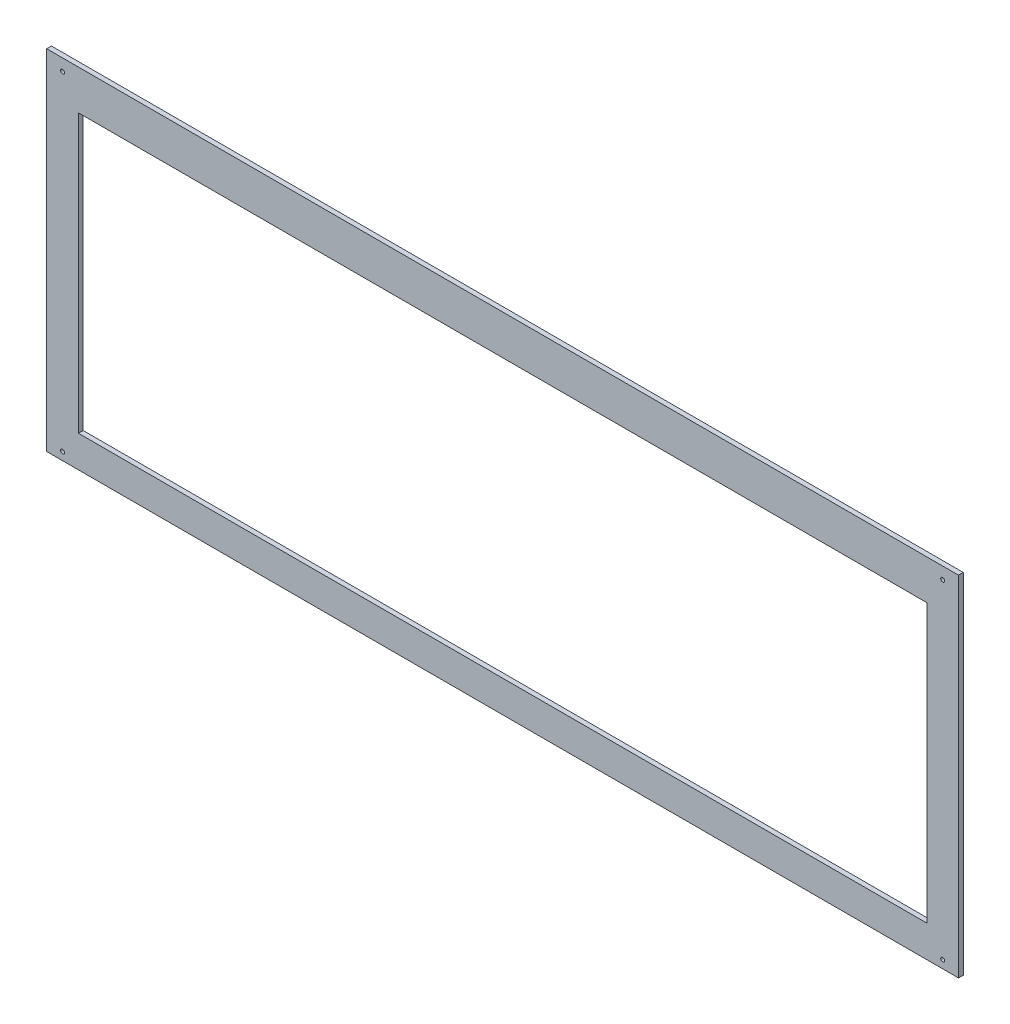
ISO-10303-21;
HEADER;
FILE_DESCRIPTION(('STEP AP214'),'2;1');
FILE_NAME('part.step','',(''),(''),'','','');
FILE_SCHEMA(('AUTOMOTIVE_DESIGN { 1 0 10303 214 1 1 1 1 }'));
ENDSEC;
DATA;
#1=APPLICATION_CONTEXT('core data for automotive mechanical design processes');
#2=APPLICATION_PROTOCOL_DEFINITION('international standard','automotive_design',2000,#1);
#3=PRODUCT_CONTEXT('',#1,'mechanical');
#4=PRODUCT('Part','Part','',(#3));
#5=PRODUCT_RELATED_PRODUCT_CATEGORY('part','',(#4));
#6=PRODUCT_DEFINITION_FORMATION('','',#4);
#7=PRODUCT_DEFINITION_CONTEXT('part definition',#1,'design');
#8=PRODUCT_DEFINITION('design','',#6,#7);
#9=PRODUCT_DEFINITION_SHAPE('','',#8);
#10=(LENGTH_UNIT() NAMED_UNIT(*) SI_UNIT(.MILLI.,.METRE.));
#11=(NAMED_UNIT(*) PLANE_ANGLE_UNIT() SI_UNIT($,.RADIAN.));
#12=(NAMED_UNIT(*) SI_UNIT($,.STERADIAN.) SOLID_ANGLE_UNIT());
#13=UNCERTAINTY_MEASURE_WITH_UNIT(LENGTH_MEASURE(1.E-05),#10,'distance_accuracy_value','');
#14=(GEOMETRIC_REPRESENTATION_CONTEXT(3) GLOBAL_UNCERTAINTY_ASSIGNED_CONTEXT((#13)) GLOBAL_UNIT_ASSIGNED_CONTEXT((#10,
#11,#12)) REPRESENTATION_CONTEXT('',''));
#15=CARTESIAN_POINT('',(0.,0.,0.));
#16=DIRECTION('',(0.,0.,1.));
#17=DIRECTION('',(1.,0.,0.));
#18=AXIS2_PLACEMENT_3D('',#15,#16,#17);
#19=CARTESIAN_POINT('',(0.,0.,6.));
#20=DIRECTION('',(0.,0.,1.));
#21=DIRECTION('',(1.,0.,0.));
#22=AXIS2_PLACEMENT_3D('',#19,#20,#21);
#23=PLANE('',#22);
#24=CARTESIAN_POINT('',(555.,210.,6.));
#25=DIRECTION('',(0.,0.,1.));
#26=DIRECTION('',(1.,0.,0.));
#27=AXIS2_PLACEMENT_3D('',#24,#25,#26);
#28=CIRCLE('',#27,2.49999999999991);
#29=CARTESIAN_POINT('',(557.5,210.,6.));
#30=VERTEX_POINT('',#29);
#31=EDGE_CURVE('E321',#30,#30,#28,.T.);
#32=ORIENTED_EDGE('',*,*,#31,.F.);
#33=EDGE_LOOP('',(#32));
#34=FACE_BOUND('',#33,.T.);
#35=CARTESIAN_POINT('',(555.,-205.,6.));
#36=DIRECTION('',(0.,0.,1.));
#37=DIRECTION('',(1.,0.,0.));
#38=AXIS2_PLACEMENT_3D('',#35,#36,#37);
#39=CIRCLE('',#38,2.49999999999991);
#40=CARTESIAN_POINT('',(557.5,-205.,6.));
#41=VERTEX_POINT('',#40);
#42=EDGE_CURVE('E323',#41,#41,#39,.T.);
#43=ORIENTED_EDGE('',*,*,#42,.F.);
#44=EDGE_LOOP('',(#43));
#45=FACE_BOUND('',#44,.T.);
#46=CARTESIAN_POINT('',(-555.,-205.,6.));
#47=DIRECTION('',(0.,0.,1.));
#48=DIRECTION('',(1.,0.,0.));
#49=AXIS2_PLACEMENT_3D('',#46,#47,#48);
#50=CIRCLE('',#49,2.49999999999991);
#51=CARTESIAN_POINT('',(-552.5,-205.,6.));
#52=VERTEX_POINT('',#51);
#53=EDGE_CURVE('E329',#52,#52,#50,.T.);
#54=ORIENTED_EDGE('',*,*,#53,.F.);
#55=EDGE_LOOP('',(#54));
#56=FACE_BOUND('',#55,.T.);
#57=CARTESIAN_POINT('',(-555.,210.,6.));
#58=DIRECTION('',(0.,0.,1.));
#59=DIRECTION('',(1.,0.,0.));
#60=AXIS2_PLACEMENT_3D('',#57,#58,#59);
#61=CIRCLE('',#60,2.49999999999991);
#62=CARTESIAN_POINT('',(-552.5,210.,6.));
#63=VERTEX_POINT('',#62);
#64=EDGE_CURVE('E335',#63,#63,#61,.T.);
#65=ORIENTED_EDGE('',*,*,#64,.F.);
#66=EDGE_LOOP('',(#65));
#67=FACE_BOUND('',#66,.T.);
#68=DIRECTION('',(1.,0.,0.));
#69=VECTOR('',#68,1.);
#70=CARTESIAN_POINT('',(-575.,-215.,6.));
#71=LINE('',#70,#69);
#72=CARTESIAN_POINT('',(-575.,-215.,6.));
#73=VERTEX_POINT('',#72);
#74=CARTESIAN_POINT('',(575.,-215.,6.));
#75=VERTEX_POINT('',#74);
#76=EDGE_CURVE('E136',#73,#75,#71,.T.);
#77=ORIENTED_EDGE('',*,*,#76,.T.);
#78=DIRECTION('',(0.,1.,0.));
#79=VECTOR('',#78,1.);
#80=CARTESIAN_POINT('',(575.,-215.,6.));
#81=LINE('',#80,#79);
#82=CARTESIAN_POINT('',(575.,225.,6.));
#83=VERTEX_POINT('',#82);
#84=EDGE_CURVE('E139',#75,#83,#81,.T.);
#85=ORIENTED_EDGE('',*,*,#84,.T.);
#86=DIRECTION('',(-1.,0.,0.));
#87=VECTOR('',#86,1.);
#88=CARTESIAN_POINT('',(535.,225.,6.));
#89=LINE('',#88,#87);
#90=CARTESIAN_POINT('',(-575.,225.,6.));
#91=VERTEX_POINT('',#90);
#92=EDGE_CURVE('E142',#83,#91,#89,.T.);
#93=ORIENTED_EDGE('',*,*,#92,.T.);
#94=DIRECTION('',(0.,-1.,0.));
#95=VECTOR('',#94,1.);
#96=CARTESIAN_POINT('',(-575.,175.,6.));
#97=LINE('',#96,#95);
#98=EDGE_CURVE('E144',#91,#73,#97,.T.);
#99=ORIENTED_EDGE('',*,*,#98,.T.);
#100=EDGE_LOOP('',(#77,#85,#93,#99));
#101=FACE_BOUND('',#100,.T.);
#102=DIRECTION('',(-1.,0.,0.));
#103=VECTOR('',#102,1.);
#104=CARTESIAN_POINT('',(-535.,175.,6.));
#105=LINE('',#104,#103);
#106=CARTESIAN_POINT('',(535.,175.,6.));
#107=VERTEX_POINT('',#106);
#108=CARTESIAN_POINT('',(-535.,175.,6.));
#109=VERTEX_POINT('',#108);
#110=EDGE_CURVE('E106',#107,#109,#105,.T.);
#111=ORIENTED_EDGE('',*,*,#110,.F.);
#112=DIRECTION('',(0.,1.,0.));
#113=VECTOR('',#112,1.);
#114=CARTESIAN_POINT('',(535.,-175.,6.));
#115=LINE('',#114,#113);
#116=CARTESIAN_POINT('',(535.,-175.,6.));
#117=VERTEX_POINT('',#116);
#118=EDGE_CURVE('E98',#117,#107,#115,.T.);
#119=ORIENTED_EDGE('',*,*,#118,.F.);
#120=DIRECTION('',(1.,0.,0.));
#121=VECTOR('',#120,1.);
#122=CARTESIAN_POINT('',(-535.,-175.,6.));
#123=LINE('',#122,#121);
#124=CARTESIAN_POINT('',(-535.,-175.,6.));
#125=VERTEX_POINT('',#124);
#126=EDGE_CURVE('E120',#125,#117,#123,.T.);
#127=ORIENTED_EDGE('',*,*,#126,.F.);
#128=DIRECTION('',(0.,-1.,0.));
#129=VECTOR('',#128,1.);
#130=CARTESIAN_POINT('',(-535.,-175.,6.));
#131=LINE('',#130,#129);
#132=EDGE_CURVE('E118',#109,#125,#131,.T.);
#133=ORIENTED_EDGE('',*,*,#132,.F.);
#134=EDGE_LOOP('',(#111,#119,#127,#133));
#135=FACE_BOUND('',#134,.T.);
#136=ADVANCED_FACE('F33',(#34,#45,#56,#67,#101,#135),#23,.T.);
#137=CARTESIAN_POINT('',(0.,0.,0.));
#138=DIRECTION('',(0.,0.,1.));
#139=DIRECTION('',(1.,0.,0.));
#140=AXIS2_PLACEMENT_3D('',#137,#138,#139);
#141=PLANE('',#140);
#142=CARTESIAN_POINT('',(555.,210.,0.));
#143=DIRECTION('',(0.,0.,1.));
#144=DIRECTION('',(1.,0.,0.));
#145=AXIS2_PLACEMENT_3D('',#142,#143,#144);
#146=CIRCLE('',#145,2.49999999999991);
#147=CARTESIAN_POINT('',(557.5,210.,0.));
#148=VERTEX_POINT('',#147);
#149=EDGE_CURVE('E319',#148,#148,#146,.T.);
#150=ORIENTED_EDGE('',*,*,#149,.T.);
#151=EDGE_LOOP('',(#150));
#152=FACE_BOUND('',#151,.T.);
#153=CARTESIAN_POINT('',(555.,-205.,0.));
#154=DIRECTION('',(0.,0.,1.));
#155=DIRECTION('',(1.,0.,0.));
#156=AXIS2_PLACEMENT_3D('',#153,#154,#155);
#157=CIRCLE('',#156,2.49999999999991);
#158=CARTESIAN_POINT('',(557.5,-205.,0.));
#159=VERTEX_POINT('',#158);
#160=EDGE_CURVE('E326',#159,#159,#157,.T.);
#161=ORIENTED_EDGE('',*,*,#160,.T.);
#162=EDGE_LOOP('',(#161));
#163=FACE_BOUND('',#162,.T.);
#164=CARTESIAN_POINT('',(-555.,-205.,0.));
#165=DIRECTION('',(0.,0.,1.));
#166=DIRECTION('',(1.,0.,0.));
#167=AXIS2_PLACEMENT_3D('',#164,#165,#166);
#168=CIRCLE('',#167,2.49999999999991);
#169=CARTESIAN_POINT('',(-552.5,-205.,0.));
#170=VERTEX_POINT('',#169);
#171=EDGE_CURVE('E332',#170,#170,#168,.T.);
#172=ORIENTED_EDGE('',*,*,#171,.T.);
#173=EDGE_LOOP('',(#172));
#174=FACE_BOUND('',#173,.T.);
#175=CARTESIAN_POINT('',(-555.,210.,0.));
#176=DIRECTION('',(0.,0.,1.));
#177=DIRECTION('',(1.,0.,0.));
#178=AXIS2_PLACEMENT_3D('',#175,#176,#177);
#179=CIRCLE('',#178,2.49999999999991);
#180=CARTESIAN_POINT('',(-552.5,210.,0.));
#181=VERTEX_POINT('',#180);
#182=EDGE_CURVE('E126',#181,#181,#179,.T.);
#183=ORIENTED_EDGE('',*,*,#182,.T.);
#184=EDGE_LOOP('',(#183));
#185=FACE_BOUND('',#184,.T.);
#186=DIRECTION('',(1.,0.,0.));
#187=VECTOR('',#186,1.);
#188=CARTESIAN_POINT('',(-575.,-215.,0.));
#189=LINE('',#188,#187);
#190=CARTESIAN_POINT('',(-575.,-215.,0.));
#191=VERTEX_POINT('',#190);
#192=CARTESIAN_POINT('',(575.,-215.,0.));
#193=VERTEX_POINT('',#192);
#194=EDGE_CURVE('E114',#191,#193,#189,.T.);
#195=ORIENTED_EDGE('',*,*,#194,.F.);
#196=DIRECTION('',(0.,-1.,0.));
#197=VECTOR('',#196,1.);
#198=CARTESIAN_POINT('',(-575.,-215.,0.));
#199=LINE('',#198,#197);
#200=CARTESIAN_POINT('',(-575.,225.,0.));
#201=VERTEX_POINT('',#200);
#202=EDGE_CURVE('E140',#201,#191,#199,.T.);
#203=ORIENTED_EDGE('',*,*,#202,.F.);
#204=DIRECTION('',(-1.,0.,0.));
#205=VECTOR('',#204,1.);
#206=CARTESIAN_POINT('',(-575.,225.,0.));
#207=LINE('',#206,#205);
#208=CARTESIAN_POINT('',(575.,225.,0.));
#209=VERTEX_POINT('',#208);
#210=EDGE_CURVE('E152',#209,#201,#207,.T.);
#211=ORIENTED_EDGE('',*,*,#210,.F.);
#212=DIRECTION('',(0.,1.,0.));
#213=VECTOR('',#212,1.);
#214=CARTESIAN_POINT('',(575.,225.,0.));
#215=LINE('',#214,#213);
#216=EDGE_CURVE('E149',#193,#209,#215,.T.);
#217=ORIENTED_EDGE('',*,*,#216,.F.);
#218=EDGE_LOOP('',(#195,#203,#211,#217));
#219=FACE_BOUND('',#218,.T.);
#220=DIRECTION('',(0.,1.,0.));
#221=VECTOR('',#220,1.);
#222=CARTESIAN_POINT('',(535.,-175.,0.));
#223=LINE('',#222,#221);
#224=CARTESIAN_POINT('',(535.,-175.,0.));
#225=VERTEX_POINT('',#224);
#226=CARTESIAN_POINT('',(535.,175.,0.));
#227=VERTEX_POINT('',#226);
#228=EDGE_CURVE('E56',#225,#227,#223,.T.);
#229=ORIENTED_EDGE('',*,*,#228,.T.);
#230=DIRECTION('',(-1.,0.,0.));
#231=VECTOR('',#230,1.);
#232=CARTESIAN_POINT('',(-535.,175.,0.));
#233=LINE('',#232,#231);
#234=CARTESIAN_POINT('',(-535.,175.,0.));
#235=VERTEX_POINT('',#234);
#236=EDGE_CURVE('E113',#227,#235,#233,.T.);
#237=ORIENTED_EDGE('',*,*,#236,.T.);
#238=DIRECTION('',(0.,-1.,0.));
#239=VECTOR('',#238,1.);
#240=CARTESIAN_POINT('',(-535.,-175.,0.));
#241=LINE('',#240,#239);
#242=CARTESIAN_POINT('',(-535.,-175.,0.));
#243=VERTEX_POINT('',#242);
#244=EDGE_CURVE('E128',#235,#243,#241,.T.);
#245=ORIENTED_EDGE('',*,*,#244,.T.);
#246=DIRECTION('',(1.,0.,0.));
#247=VECTOR('',#246,1.);
#248=CARTESIAN_POINT('',(-535.,-175.,0.));
#249=LINE('',#248,#247);
#250=EDGE_CURVE('E107',#243,#225,#249,.T.);
#251=ORIENTED_EDGE('',*,*,#250,.T.);
#252=EDGE_LOOP('',(#229,#237,#245,#251));
#253=FACE_BOUND('',#252,.T.);
#254=ADVANCED_FACE('F171',(#152,#163,#174,#185,#219,#253),#141,.F.);
#255=CARTESIAN_POINT('',(-575.,-215.,6.));
#256=DIRECTION('',(0.,1.,0.));
#257=DIRECTION('',(0.,0.,1.));
#258=AXIS2_PLACEMENT_3D('',#255,#256,#257);
#259=PLANE('',#258);
#260=ORIENTED_EDGE('',*,*,#194,.T.);
#261=DIRECTION('',(0.,0.,-1.));
#262=VECTOR('',#261,1.);
#263=CARTESIAN_POINT('',(575.,-215.,6.));
#264=LINE('',#263,#262);
#265=EDGE_CURVE('E11',#75,#193,#264,.T.);
#266=ORIENTED_EDGE('',*,*,#265,.F.);
#267=ORIENTED_EDGE('',*,*,#76,.F.);
#268=DIRECTION('',(0.,0.,-1.));
#269=VECTOR('',#268,1.);
#270=CARTESIAN_POINT('',(-575.,-215.,6.));
#271=LINE('',#270,#269);
#272=EDGE_CURVE('E146',#73,#191,#271,.T.);
#273=ORIENTED_EDGE('',*,*,#272,.T.);
#274=EDGE_LOOP('',(#260,#266,#267,#273));
#275=FACE_BOUND('',#274,.T.);
#276=ADVANCED_FACE('F35',(#275),#259,.F.);
#277=CARTESIAN_POINT('',(575.,225.,6.));
#278=DIRECTION('',(-1.,0.,0.));
#279=DIRECTION('',(0.,0.,1.));
#280=AXIS2_PLACEMENT_3D('',#277,#278,#279);
#281=PLANE('',#280);
#282=ORIENTED_EDGE('',*,*,#216,.T.);
#283=DIRECTION('',(0.,0.,-1.));
#284=VECTOR('',#283,1.);
#285=CARTESIAN_POINT('',(575.,225.,6.));
#286=LINE('',#285,#284);
#287=EDGE_CURVE('E41',#83,#209,#286,.T.);
#288=ORIENTED_EDGE('',*,*,#287,.F.);
#289=ORIENTED_EDGE('',*,*,#84,.F.);
#290=ORIENTED_EDGE('',*,*,#265,.T.);
#291=EDGE_LOOP('',(#282,#288,#289,#290));
#292=FACE_BOUND('',#291,.T.);
#293=ADVANCED_FACE('F167',(#292),#281,.F.);
#294=CARTESIAN_POINT('',(-575.,225.,6.));
#295=DIRECTION('',(0.,-1.,0.));
#296=DIRECTION('',(0.,0.,-1.));
#297=AXIS2_PLACEMENT_3D('',#294,#295,#296);
#298=PLANE('',#297);
#299=ORIENTED_EDGE('',*,*,#210,.T.);
#300=DIRECTION('',(0.,0.,-1.));
#301=VECTOR('',#300,1.);
#302=CARTESIAN_POINT('',(-575.,225.,6.));
#303=LINE('',#302,#301);
#304=EDGE_CURVE('E158',#91,#201,#303,.T.);
#305=ORIENTED_EDGE('',*,*,#304,.F.);
#306=ORIENTED_EDGE('',*,*,#92,.F.);
#307=ORIENTED_EDGE('',*,*,#287,.T.);
#308=EDGE_LOOP('',(#299,#305,#306,#307));
#309=FACE_BOUND('',#308,.T.);
#310=ADVANCED_FACE('F164',(#309),#298,.F.);
#311=CARTESIAN_POINT('',(-575.,-215.,6.));
#312=DIRECTION('',(1.,0.,0.));
#313=DIRECTION('',(0.,0.,-1.));
#314=AXIS2_PLACEMENT_3D('',#311,#312,#313);
#315=PLANE('',#314);
#316=ORIENTED_EDGE('',*,*,#202,.T.);
#317=ORIENTED_EDGE('',*,*,#272,.F.);
#318=ORIENTED_EDGE('',*,*,#98,.F.);
#319=ORIENTED_EDGE('',*,*,#304,.T.);
#320=EDGE_LOOP('',(#316,#317,#318,#319));
#321=FACE_BOUND('',#320,.T.);
#322=ADVANCED_FACE('F175',(#321),#315,.F.);
#323=CARTESIAN_POINT('',(535.,-175.,6.));
#324=DIRECTION('',(-1.,0.,0.));
#325=DIRECTION('',(0.,0.,1.));
#326=AXIS2_PLACEMENT_3D('',#323,#324,#325);
#327=PLANE('',#326);
#328=ORIENTED_EDGE('',*,*,#228,.F.);
#329=DIRECTION('',(0.,0.,-1.));
#330=VECTOR('',#329,1.);
#331=CARTESIAN_POINT('',(535.,-175.,6.));
#332=LINE('',#331,#330);
#333=EDGE_CURVE('E102',#117,#225,#332,.T.);
#334=ORIENTED_EDGE('',*,*,#333,.F.);
#335=ORIENTED_EDGE('',*,*,#118,.T.);
#336=DIRECTION('',(0.,0.,-1.));
#337=VECTOR('',#336,1.);
#338=CARTESIAN_POINT('',(535.,175.,6.));
#339=LINE('',#338,#337);
#340=EDGE_CURVE('E101',#107,#227,#339,.T.);
#341=ORIENTED_EDGE('',*,*,#340,.T.);
#342=EDGE_LOOP('',(#328,#334,#335,#341));
#343=FACE_BOUND('',#342,.T.);
#344=ADVANCED_FACE('F100',(#343),#327,.T.);
#345=CARTESIAN_POINT('',(-535.,175.,6.));
#346=DIRECTION('',(0.,-1.,0.));
#347=DIRECTION('',(0.,0.,-1.));
#348=AXIS2_PLACEMENT_3D('',#345,#346,#347);
#349=PLANE('',#348);
#350=ORIENTED_EDGE('',*,*,#236,.F.);
#351=ORIENTED_EDGE('',*,*,#340,.F.);
#352=ORIENTED_EDGE('',*,*,#110,.T.);
#353=DIRECTION('',(0.,0.,-1.));
#354=VECTOR('',#353,1.);
#355=CARTESIAN_POINT('',(-535.,175.,6.));
#356=LINE('',#355,#354);
#357=EDGE_CURVE('E115',#109,#235,#356,.T.);
#358=ORIENTED_EDGE('',*,*,#357,.T.);
#359=EDGE_LOOP('',(#350,#351,#352,#358));
#360=FACE_BOUND('',#359,.T.);
#361=ADVANCED_FACE('F110',(#360),#349,.T.);
#362=CARTESIAN_POINT('',(-535.,-175.,6.));
#363=DIRECTION('',(1.,0.,0.));
#364=DIRECTION('',(0.,0.,-1.));
#365=AXIS2_PLACEMENT_3D('',#362,#363,#364);
#366=PLANE('',#365);
#367=ORIENTED_EDGE('',*,*,#244,.F.);
#368=ORIENTED_EDGE('',*,*,#357,.F.);
#369=ORIENTED_EDGE('',*,*,#132,.T.);
#370=DIRECTION('',(0.,0.,-1.));
#371=VECTOR('',#370,1.);
#372=CARTESIAN_POINT('',(-535.,-175.,6.));
#373=LINE('',#372,#371);
#374=EDGE_CURVE('E48',#125,#243,#373,.T.);
#375=ORIENTED_EDGE('',*,*,#374,.T.);
#376=EDGE_LOOP('',(#367,#368,#369,#375));
#377=FACE_BOUND('',#376,.T.);
#378=ADVANCED_FACE('F260',(#377),#366,.T.);
#379=CARTESIAN_POINT('',(-535.,-175.,6.));
#380=DIRECTION('',(0.,1.,0.));
#381=DIRECTION('',(0.,0.,1.));
#382=AXIS2_PLACEMENT_3D('',#379,#380,#381);
#383=PLANE('',#382);
#384=ORIENTED_EDGE('',*,*,#250,.F.);
#385=ORIENTED_EDGE('',*,*,#374,.F.);
#386=ORIENTED_EDGE('',*,*,#126,.T.);
#387=ORIENTED_EDGE('',*,*,#333,.T.);
#388=EDGE_LOOP('',(#384,#385,#386,#387));
#389=FACE_BOUND('',#388,.T.);
#390=ADVANCED_FACE('F220',(#389),#383,.T.);
#391=CARTESIAN_POINT('',(-555.,210.,0.));
#392=DIRECTION('',(0.,0.,1.));
#393=DIRECTION('',(1.,0.,0.));
#394=AXIS2_PLACEMENT_3D('',#391,#392,#393);
#395=CYLINDRICAL_SURFACE('',#394,2.49999999999991);
#396=ORIENTED_EDGE('',*,*,#182,.F.);
#397=EDGE_LOOP('',(#396));
#398=FACE_BOUND('',#397,.T.);
#399=ORIENTED_EDGE('',*,*,#64,.T.);
#400=EDGE_LOOP('',(#399));
#401=FACE_BOUND('',#400,.T.);
#402=ADVANCED_FACE('F214',(#398,#401),#395,.F.);
#403=CARTESIAN_POINT('',(-555.,-205.,0.));
#404=DIRECTION('',(0.,0.,1.));
#405=DIRECTION('',(1.,0.,0.));
#406=AXIS2_PLACEMENT_3D('',#403,#404,#405);
#407=CYLINDRICAL_SURFACE('',#406,2.49999999999991);
#408=ORIENTED_EDGE('',*,*,#171,.F.);
#409=EDGE_LOOP('',(#408));
#410=FACE_BOUND('',#409,.T.);
#411=ORIENTED_EDGE('',*,*,#53,.T.);
#412=EDGE_LOOP('',(#411));
#413=FACE_BOUND('',#412,.T.);
#414=ADVANCED_FACE('F219',(#410,#413),#407,.F.);
#415=CARTESIAN_POINT('',(555.,-205.,0.));
#416=DIRECTION('',(0.,0.,1.));
#417=DIRECTION('',(1.,0.,0.));
#418=AXIS2_PLACEMENT_3D('',#415,#416,#417);
#419=CYLINDRICAL_SURFACE('',#418,2.49999999999991);
#420=ORIENTED_EDGE('',*,*,#160,.F.);
#421=EDGE_LOOP('',(#420));
#422=FACE_BOUND('',#421,.T.);
#423=ORIENTED_EDGE('',*,*,#42,.T.);
#424=EDGE_LOOP('',(#423));
#425=FACE_BOUND('',#424,.T.);
#426=ADVANCED_FACE('F232',(#422,#425),#419,.F.);
#427=CARTESIAN_POINT('',(555.,210.,0.));
#428=DIRECTION('',(0.,0.,1.));
#429=DIRECTION('',(1.,0.,0.));
#430=AXIS2_PLACEMENT_3D('',#427,#428,#429);
#431=CYLINDRICAL_SURFACE('',#430,2.49999999999991);
#432=ORIENTED_EDGE('',*,*,#149,.F.);
#433=EDGE_LOOP('',(#432));
#434=FACE_BOUND('',#433,.T.);
#435=ORIENTED_EDGE('',*,*,#31,.T.);
#436=EDGE_LOOP('',(#435));
#437=FACE_BOUND('',#436,.T.);
#438=ADVANCED_FACE('F242',(#434,#437),#431,.F.);
#439=CLOSED_SHELL('',(#136,#254,#276,#293,#310,#322,#344,#361,#378,#390,#402,#414,#426,#438));
#440=MANIFOLD_SOLID_BREP('B2',#439);
#441=ADVANCED_BREP_SHAPE_REPRESENTATION('',(#18,#440),#14);
#442=SHAPE_DEFINITION_REPRESENTATION(#9,#441);
ENDSEC;
END-ISO-10303-21;
